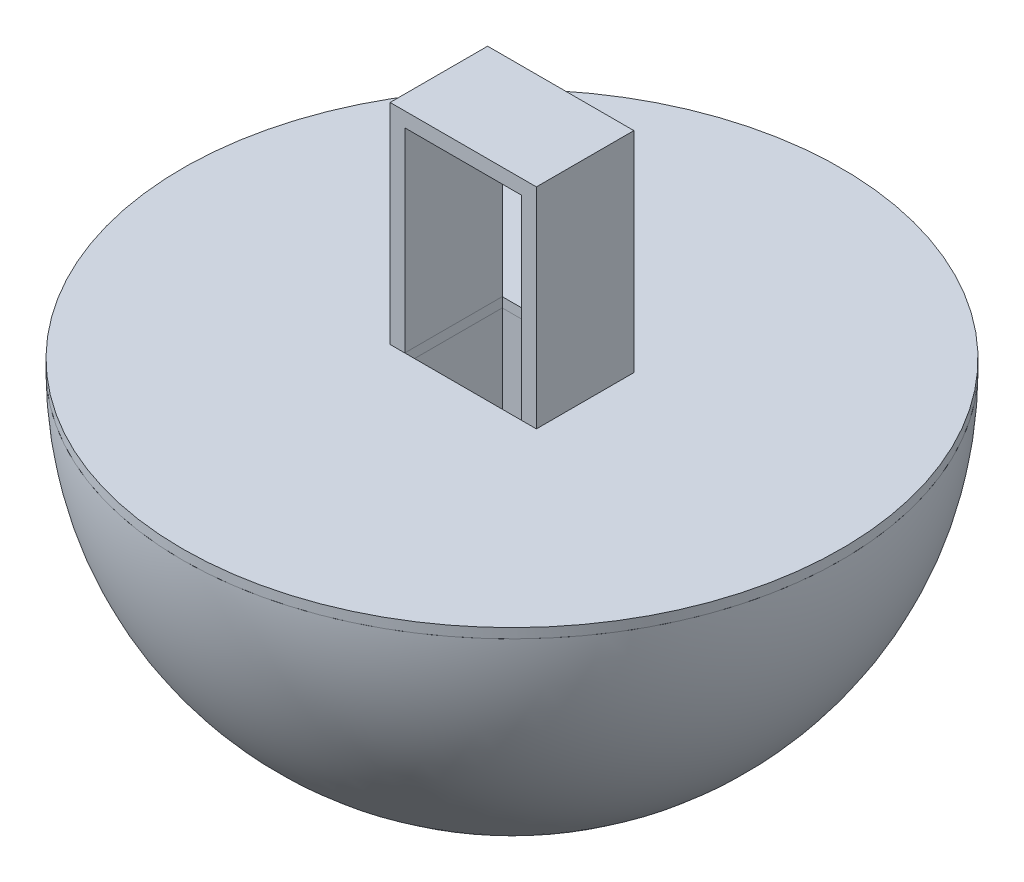
ISO-10303-21;
HEADER;
FILE_DESCRIPTION(('STEP AP214'),'2;1');
FILE_NAME('part.step','',(''),(''),'','','');
FILE_SCHEMA(('AUTOMOTIVE_DESIGN { 1 0 10303 214 1 1 1 1 }'));
ENDSEC;
DATA;
#1=APPLICATION_CONTEXT('core data for automotive mechanical design processes');
#2=APPLICATION_PROTOCOL_DEFINITION('international standard','automotive_design',2000,#1);
#3=PRODUCT_CONTEXT('',#1,'mechanical');
#4=PRODUCT('Part','Part','',(#3));
#5=PRODUCT_RELATED_PRODUCT_CATEGORY('part','',(#4));
#6=PRODUCT_DEFINITION_FORMATION('','',#4);
#7=PRODUCT_DEFINITION_CONTEXT('part definition',#1,'design');
#8=PRODUCT_DEFINITION('design','',#6,#7);
#9=PRODUCT_DEFINITION_SHAPE('','',#8);
#10=(LENGTH_UNIT() NAMED_UNIT(*) SI_UNIT(.MILLI.,.METRE.));
#11=(NAMED_UNIT(*) PLANE_ANGLE_UNIT() SI_UNIT($,.RADIAN.));
#12=(NAMED_UNIT(*) SI_UNIT($,.STERADIAN.) SOLID_ANGLE_UNIT());
#13=UNCERTAINTY_MEASURE_WITH_UNIT(LENGTH_MEASURE(1.E-05),#10,'distance_accuracy_value','');
#14=(GEOMETRIC_REPRESENTATION_CONTEXT(3) GLOBAL_UNCERTAINTY_ASSIGNED_CONTEXT((#13)) GLOBAL_UNIT_ASSIGNED_CONTEXT((#10,
#11,#12)) REPRESENTATION_CONTEXT('',''));
#15=CARTESIAN_POINT('',(0.,0.,0.));
#16=DIRECTION('',(0.,0.,1.));
#17=DIRECTION('',(1.,0.,0.));
#18=AXIS2_PLACEMENT_3D('',#15,#16,#17);
#19=CARTESIAN_POINT('',(0.,54.8,0.));
#20=DIRECTION('',(0.,1.,0.));
#21=DIRECTION('',(0.,0.,1.));
#22=AXIS2_PLACEMENT_3D('',#19,#20,#21);
#23=PLANE('',#22);
#24=DIRECTION('',(0.,0.,1.));
#25=VECTOR('',#24,1.);
#26=CARTESIAN_POINT('',(6.,54.8,-5.));
#27=LINE('',#26,#25);
#28=CARTESIAN_POINT('',(6.,54.8,-5.));
#29=VERTEX_POINT('',#28);
#30=CARTESIAN_POINT('',(6.,54.8,5.));
#31=VERTEX_POINT('',#30);
#32=EDGE_CURVE('E138',#29,#31,#27,.T.);
#33=ORIENTED_EDGE('',*,*,#32,.T.);
#34=DIRECTION('',(1.,0.,0.));
#35=VECTOR('',#34,1.);
#36=CARTESIAN_POINT('',(-7.5,54.8,5.));
#37=LINE('',#36,#35);
#38=CARTESIAN_POINT('',(-6.,54.8,5.));
#39=VERTEX_POINT('',#38);
#40=EDGE_CURVE('E135',#39,#31,#37,.T.);
#41=ORIENTED_EDGE('',*,*,#40,.F.);
#42=DIRECTION('',(0.,0.,-1.));
#43=VECTOR('',#42,1.);
#44=CARTESIAN_POINT('',(-6.,54.8,-5.));
#45=LINE('',#44,#43);
#46=CARTESIAN_POINT('',(-6.,54.8,-5.));
#47=VERTEX_POINT('',#46);
#48=EDGE_CURVE('E123',#39,#47,#45,.T.);
#49=ORIENTED_EDGE('',*,*,#48,.T.);
#50=DIRECTION('',(-1.,0.,0.));
#51=VECTOR('',#50,1.);
#52=CARTESIAN_POINT('',(-7.5,54.8,-5.));
#53=LINE('',#52,#51);
#54=EDGE_CURVE('E140',#29,#47,#53,.T.);
#55=ORIENTED_EDGE('',*,*,#54,.F.);
#56=EDGE_LOOP('',(#33,#41,#49,#55));
#57=FACE_BOUND('',#56,.T.);
#58=ADVANCED_FACE('F67',(#57),#23,.F.);
#59=CARTESIAN_POINT('',(-6.,54.8,-5.));
#60=DIRECTION('',(-1.,0.,0.));
#61=DIRECTION('',(0.,0.,1.));
#62=AXIS2_PLACEMENT_3D('',#59,#60,#61);
#63=PLANE('',#62);
#64=DIRECTION('',(0.,0.,-1.));
#65=VECTOR('',#64,1.);
#66=CARTESIAN_POINT('',(-6.,34.8,-5.));
#67=LINE('',#66,#65);
#68=CARTESIAN_POINT('',(-6.,34.8,5.));
#69=VERTEX_POINT('',#68);
#70=CARTESIAN_POINT('',(-6.,34.8,-5.));
#71=VERTEX_POINT('',#70);
#72=EDGE_CURVE('E122',#69,#71,#67,.T.);
#73=ORIENTED_EDGE('',*,*,#72,.T.);
#74=DIRECTION('',(0.,-1.,0.));
#75=VECTOR('',#74,1.);
#76=CARTESIAN_POINT('',(-6.,54.8,-5.));
#77=LINE('',#76,#75);
#78=EDGE_CURVE('E13',#47,#71,#77,.T.);
#79=ORIENTED_EDGE('',*,*,#78,.F.);
#80=ORIENTED_EDGE('',*,*,#48,.F.);
#81=DIRECTION('',(0.,-1.,0.));
#82=VECTOR('',#81,1.);
#83=CARTESIAN_POINT('',(-6.,54.8,5.));
#84=LINE('',#83,#82);
#85=EDGE_CURVE('E83',#39,#69,#84,.T.);
#86=ORIENTED_EDGE('',*,*,#85,.T.);
#87=EDGE_LOOP('',(#73,#79,#80,#86));
#88=FACE_BOUND('',#87,.T.);
#89=ADVANCED_FACE('F69',(#88),#63,.F.);
#90=CARTESIAN_POINT('',(-6.,54.8,-5.));
#91=DIRECTION('',(0.,0.,1.));
#92=DIRECTION('',(1.,0.,0.));
#93=AXIS2_PLACEMENT_3D('',#90,#91,#92);
#94=PLANE('',#93);
#95=DIRECTION('',(-1.,0.,0.));
#96=VECTOR('',#95,1.);
#97=CARTESIAN_POINT('',(-6.,34.8,-5.));
#98=LINE('',#97,#96);
#99=CARTESIAN_POINT('',(-7.5,34.8,-5.));
#100=VERTEX_POINT('',#99);
#101=EDGE_CURVE('E111',#71,#100,#98,.T.);
#102=ORIENTED_EDGE('',*,*,#101,.T.);
#103=DIRECTION('',(0.,-1.,0.));
#104=VECTOR('',#103,1.);
#105=CARTESIAN_POINT('',(-7.5,54.8,-5.));
#106=LINE('',#105,#104);
#107=CARTESIAN_POINT('',(-7.5,56.3,-5.));
#108=VERTEX_POINT('',#107);
#109=EDGE_CURVE('E76',#108,#100,#106,.T.);
#110=ORIENTED_EDGE('',*,*,#109,.F.);
#111=DIRECTION('',(-1.,0.,0.));
#112=VECTOR('',#111,1.);
#113=CARTESIAN_POINT('',(-7.5,56.3,-5.));
#114=LINE('',#113,#112);
#115=CARTESIAN_POINT('',(7.5,56.3,-5.));
#116=VERTEX_POINT('',#115);
#117=EDGE_CURVE('E150',#116,#108,#114,.T.);
#118=ORIENTED_EDGE('',*,*,#117,.F.);
#119=DIRECTION('',(0.,-1.,0.));
#120=VECTOR('',#119,1.);
#121=CARTESIAN_POINT('',(7.5,56.3,-5.));
#122=LINE('',#121,#120);
#123=CARTESIAN_POINT('',(7.5,34.8,-5.));
#124=VERTEX_POINT('',#123);
#125=EDGE_CURVE('E153',#116,#124,#122,.T.);
#126=ORIENTED_EDGE('',*,*,#125,.T.);
#127=DIRECTION('',(-1.,0.,0.));
#128=VECTOR('',#127,1.);
#129=CARTESIAN_POINT('',(6.,34.8,-5.));
#130=LINE('',#129,#128);
#131=CARTESIAN_POINT('',(6.,34.8,-5.));
#132=VERTEX_POINT('',#131);
#133=EDGE_CURVE('E194',#124,#132,#130,.T.);
#134=ORIENTED_EDGE('',*,*,#133,.T.);
#135=DIRECTION('',(0.,-1.,0.));
#136=VECTOR('',#135,1.);
#137=CARTESIAN_POINT('',(6.,54.8,-5.));
#138=LINE('',#137,#136);
#139=EDGE_CURVE('E168',#29,#132,#138,.T.);
#140=ORIENTED_EDGE('',*,*,#139,.F.);
#141=ORIENTED_EDGE('',*,*,#54,.T.);
#142=ORIENTED_EDGE('',*,*,#78,.T.);
#143=EDGE_LOOP('',(#102,#110,#118,#126,#134,#140,#141,#142));
#144=FACE_BOUND('',#143,.T.);
#145=ADVANCED_FACE('F160',(#144),#94,.F.);
#146=CARTESIAN_POINT('',(-7.5,54.8,-5.));
#147=DIRECTION('',(1.,0.,0.));
#148=DIRECTION('',(0.,0.,-1.));
#149=AXIS2_PLACEMENT_3D('',#146,#147,#148);
#150=PLANE('',#149);
#151=DIRECTION('',(0.,0.,1.));
#152=VECTOR('',#151,1.);
#153=CARTESIAN_POINT('',(-7.5,34.8,-5.));
#154=LINE('',#153,#152);
#155=CARTESIAN_POINT('',(-7.5,34.8,5.));
#156=VERTEX_POINT('',#155);
#157=EDGE_CURVE('E100',#100,#156,#154,.T.);
#158=ORIENTED_EDGE('',*,*,#157,.T.);
#159=DIRECTION('',(0.,-1.,0.));
#160=VECTOR('',#159,1.);
#161=CARTESIAN_POINT('',(-7.5,54.8,5.));
#162=LINE('',#161,#160);
#163=CARTESIAN_POINT('',(-7.5,56.3,5.));
#164=VERTEX_POINT('',#163);
#165=EDGE_CURVE('E105',#164,#156,#162,.T.);
#166=ORIENTED_EDGE('',*,*,#165,.F.);
#167=DIRECTION('',(0.,0.,1.));
#168=VECTOR('',#167,1.);
#169=CARTESIAN_POINT('',(-7.5,56.3,-5.));
#170=LINE('',#169,#168);
#171=EDGE_CURVE('E144',#108,#164,#170,.T.);
#172=ORIENTED_EDGE('',*,*,#171,.F.);
#173=ORIENTED_EDGE('',*,*,#109,.T.);
#174=EDGE_LOOP('',(#158,#166,#172,#173));
#175=FACE_BOUND('',#174,.T.);
#176=ADVANCED_FACE('F102',(#175),#150,.F.);
#177=CARTESIAN_POINT('',(-6.,54.8,5.));
#178=DIRECTION('',(0.,0.,-1.));
#179=DIRECTION('',(-1.,0.,0.));
#180=AXIS2_PLACEMENT_3D('',#177,#178,#179);
#181=PLANE('',#180);
#182=DIRECTION('',(1.,0.,0.));
#183=VECTOR('',#182,1.);
#184=CARTESIAN_POINT('',(-6.,34.8,5.));
#185=LINE('',#184,#183);
#186=EDGE_CURVE('E110',#156,#69,#185,.T.);
#187=ORIENTED_EDGE('',*,*,#186,.T.);
#188=ORIENTED_EDGE('',*,*,#85,.F.);
#189=ORIENTED_EDGE('',*,*,#40,.T.);
#190=DIRECTION('',(0.,-1.,0.));
#191=VECTOR('',#190,1.);
#192=CARTESIAN_POINT('',(6.,54.8,5.));
#193=LINE('',#192,#191);
#194=CARTESIAN_POINT('',(6.,34.8,5.));
#195=VERTEX_POINT('',#194);
#196=EDGE_CURVE('E204',#31,#195,#193,.T.);
#197=ORIENTED_EDGE('',*,*,#196,.T.);
#198=DIRECTION('',(1.,0.,0.));
#199=VECTOR('',#198,1.);
#200=CARTESIAN_POINT('',(6.,34.8,5.));
#201=LINE('',#200,#199);
#202=CARTESIAN_POINT('',(7.5,34.8,5.));
#203=VERTEX_POINT('',#202);
#204=EDGE_CURVE('E147',#195,#203,#201,.T.);
#205=ORIENTED_EDGE('',*,*,#204,.T.);
#206=DIRECTION('',(0.,-1.,0.));
#207=VECTOR('',#206,1.);
#208=CARTESIAN_POINT('',(7.5,56.3,5.));
#209=LINE('',#208,#207);
#210=CARTESIAN_POINT('',(7.5,56.3,5.));
#211=VERTEX_POINT('',#210);
#212=EDGE_CURVE('E156',#211,#203,#209,.T.);
#213=ORIENTED_EDGE('',*,*,#212,.F.);
#214=DIRECTION('',(1.,0.,0.));
#215=VECTOR('',#214,1.);
#216=CARTESIAN_POINT('',(-7.5,56.3,5.));
#217=LINE('',#216,#215);
#218=EDGE_CURVE('E116',#164,#211,#217,.T.);
#219=ORIENTED_EDGE('',*,*,#218,.F.);
#220=ORIENTED_EDGE('',*,*,#165,.T.);
#221=EDGE_LOOP('',(#187,#188,#189,#197,#205,#213,#219,#220));
#222=FACE_BOUND('',#221,.T.);
#223=ADVANCED_FACE('F113',(#222),#181,.F.);
#224=CARTESIAN_POINT('',(0.,34.8,0.));
#225=DIRECTION('',(0.,-1.,0.));
#226=DIRECTION('',(0.,0.,-1.));
#227=AXIS2_PLACEMENT_3D('',#224,#225,#226);
#228=PLANE('',#227);
#229=ORIENTED_EDGE('',*,*,#72,.F.);
#230=ORIENTED_EDGE('',*,*,#186,.F.);
#231=ORIENTED_EDGE('',*,*,#157,.F.);
#232=ORIENTED_EDGE('',*,*,#101,.F.);
#233=EDGE_LOOP('',(#229,#230,#231,#232));
#234=FACE_BOUND('',#233,.T.);
#235=ADVANCED_FACE('F120',(#234),#228,.T.);
#236=CARTESIAN_POINT('',(7.5,56.3,-5.));
#237=DIRECTION('',(-1.,0.,0.));
#238=DIRECTION('',(0.,0.,1.));
#239=AXIS2_PLACEMENT_3D('',#236,#237,#238);
#240=PLANE('',#239);
#241=ORIENTED_EDGE('',*,*,#212,.T.);
#242=DIRECTION('',(0.,0.,-1.));
#243=VECTOR('',#242,1.);
#244=CARTESIAN_POINT('',(7.5,34.8,-5.));
#245=LINE('',#244,#243);
#246=EDGE_CURVE('E192',#203,#124,#245,.T.);
#247=ORIENTED_EDGE('',*,*,#246,.T.);
#248=ORIENTED_EDGE('',*,*,#125,.F.);
#249=DIRECTION('',(0.,0.,-1.));
#250=VECTOR('',#249,1.);
#251=CARTESIAN_POINT('',(7.5,56.3,-5.));
#252=LINE('',#251,#250);
#253=EDGE_CURVE('E184',#211,#116,#252,.T.);
#254=ORIENTED_EDGE('',*,*,#253,.F.);
#255=EDGE_LOOP('',(#241,#247,#248,#254));
#256=FACE_BOUND('',#255,.T.);
#257=ADVANCED_FACE('F189',(#256),#240,.F.);
#258=CARTESIAN_POINT('',(0.,56.3,0.));
#259=DIRECTION('',(0.,1.,0.));
#260=DIRECTION('',(0.,0.,1.));
#261=AXIS2_PLACEMENT_3D('',#258,#259,#260);
#262=PLANE('',#261);
#263=ORIENTED_EDGE('',*,*,#171,.T.);
#264=ORIENTED_EDGE('',*,*,#218,.T.);
#265=ORIENTED_EDGE('',*,*,#253,.T.);
#266=ORIENTED_EDGE('',*,*,#117,.T.);
#267=EDGE_LOOP('',(#263,#264,#265,#266));
#268=FACE_BOUND('',#267,.T.);
#269=ADVANCED_FACE('F186',(#268),#262,.T.);
#270=CARTESIAN_POINT('',(6.,54.8,-5.));
#271=DIRECTION('',(1.,0.,0.));
#272=DIRECTION('',(0.,0.,-1.));
#273=AXIS2_PLACEMENT_3D('',#270,#271,#272);
#274=PLANE('',#273);
#275=DIRECTION('',(0.,0.,1.));
#276=VECTOR('',#275,1.);
#277=CARTESIAN_POINT('',(6.,34.8,-5.));
#278=LINE('',#277,#276);
#279=EDGE_CURVE('E141',#132,#195,#278,.T.);
#280=ORIENTED_EDGE('',*,*,#279,.T.);
#281=ORIENTED_EDGE('',*,*,#196,.F.);
#282=ORIENTED_EDGE('',*,*,#32,.F.);
#283=ORIENTED_EDGE('',*,*,#139,.T.);
#284=EDGE_LOOP('',(#280,#281,#282,#283));
#285=FACE_BOUND('',#284,.T.);
#286=ADVANCED_FACE('F207',(#285),#274,.F.);
#287=CARTESIAN_POINT('',(0.,34.8,0.));
#288=DIRECTION('',(0.,1.,0.));
#289=DIRECTION('',(0.,0.,1.));
#290=AXIS2_PLACEMENT_3D('',#287,#288,#289);
#291=PLANE('',#290);
#292=ORIENTED_EDGE('',*,*,#279,.F.);
#293=ORIENTED_EDGE('',*,*,#133,.F.);
#294=ORIENTED_EDGE('',*,*,#246,.F.);
#295=ORIENTED_EDGE('',*,*,#204,.F.);
#296=EDGE_LOOP('',(#292,#293,#294,#295));
#297=FACE_BOUND('',#296,.T.);
#298=ADVANCED_FACE('F202',(#297),#291,.F.);
#299=CLOSED_SHELL('',(#58,#89,#145,#176,#223,#235,#257,#269,#286,#298));
#300=MANIFOLD_SOLID_BREP('B2',#299);
#301=CARTESIAN_POINT('',(0.,34.8,0.));
#302=DIRECTION('',(0.,1.,0.));
#303=DIRECTION('',(0.,0.,1.));
#304=AXIS2_PLACEMENT_3D('',#301,#302,#303);
#305=PLANE('',#304);
#306=CARTESIAN_POINT('',(0.,34.8,0.));
#307=DIRECTION('',(0.,1.,0.));
#308=DIRECTION('',(0.,0.,1.));
#309=AXIS2_PLACEMENT_3D('',#306,#307,#308);
#310=CIRCLE('',#309,33.8);
#311=CARTESIAN_POINT('',(0.,34.8,33.8));
#312=VERTEX_POINT('',#311);
#313=EDGE_CURVE('E65',#312,#312,#310,.T.);
#314=ORIENTED_EDGE('',*,*,#313,.T.);
#315=EDGE_LOOP('',(#314));
#316=FACE_BOUND('',#315,.T.);
#317=DIRECTION('',(0.,0.,-1.));
#318=VECTOR('',#317,1.);
#319=CARTESIAN_POINT('',(6.,34.8,5.));
#320=LINE('',#319,#318);
#321=CARTESIAN_POINT('',(6.,34.8,5.));
#322=VERTEX_POINT('',#321);
#323=CARTESIAN_POINT('',(6.,34.8,-5.));
#324=VERTEX_POINT('',#323);
#325=EDGE_CURVE('E391',#322,#324,#320,.T.);
#326=ORIENTED_EDGE('',*,*,#325,.F.);
#327=DIRECTION('',(1.,0.,0.));
#328=VECTOR('',#327,1.);
#329=CARTESIAN_POINT('',(-6.,34.8,5.));
#330=LINE('',#329,#328);
#331=CARTESIAN_POINT('',(-6.,34.8,5.));
#332=VERTEX_POINT('',#331);
#333=EDGE_CURVE('E383',#332,#322,#330,.T.);
#334=ORIENTED_EDGE('',*,*,#333,.F.);
#335=DIRECTION('',(0.,0.,1.));
#336=VECTOR('',#335,1.);
#337=CARTESIAN_POINT('',(-6.,34.8,-5.));
#338=LINE('',#337,#336);
#339=CARTESIAN_POINT('',(-6.,34.8,-5.));
#340=VERTEX_POINT('',#339);
#341=EDGE_CURVE('E404',#340,#332,#338,.T.);
#342=ORIENTED_EDGE('',*,*,#341,.F.);
#343=DIRECTION('',(-1.,0.,0.));
#344=VECTOR('',#343,1.);
#345=CARTESIAN_POINT('',(6.,34.8,-5.));
#346=LINE('',#345,#344);
#347=EDGE_CURVE('E402',#324,#340,#346,.T.);
#348=ORIENTED_EDGE('',*,*,#347,.F.);
#349=EDGE_LOOP('',(#326,#334,#342,#348));
#350=FACE_BOUND('',#349,.T.);
#351=ADVANCED_FACE('F342',(#316,#350),#305,.T.);
#352=CARTESIAN_POINT('',(0.,33.8,0.));
#353=DIRECTION('',(0.,1.,0.));
#354=DIRECTION('',(0.,0.,1.));
#355=AXIS2_PLACEMENT_3D('',#352,#353,#354);
#356=PLANE('',#355);
#357=CARTESIAN_POINT('',(0.,33.8,0.));
#358=DIRECTION('',(0.,1.,0.));
#359=DIRECTION('',(0.,0.,1.));
#360=AXIS2_PLACEMENT_3D('',#357,#358,#359);
#361=CIRCLE('',#360,33.8);
#362=CARTESIAN_POINT('',(0.,33.8,33.8));
#363=VERTEX_POINT('',#362);
#364=EDGE_CURVE('E346',#363,#363,#361,.T.);
#365=ORIENTED_EDGE('',*,*,#364,.F.);
#366=EDGE_LOOP('',(#365));
#367=FACE_BOUND('',#366,.T.);
#368=DIRECTION('',(1.,0.,0.));
#369=VECTOR('',#368,1.);
#370=CARTESIAN_POINT('',(-6.,33.8,5.));
#371=LINE('',#370,#369);
#372=CARTESIAN_POINT('',(-6.,33.8,5.));
#373=VERTEX_POINT('',#372);
#374=CARTESIAN_POINT('',(6.,33.8,5.));
#375=VERTEX_POINT('',#374);
#376=EDGE_CURVE('E365',#373,#375,#371,.T.);
#377=ORIENTED_EDGE('',*,*,#376,.T.);
#378=DIRECTION('',(0.,0.,-1.));
#379=VECTOR('',#378,1.);
#380=CARTESIAN_POINT('',(6.,33.8,5.));
#381=LINE('',#380,#379);
#382=CARTESIAN_POINT('',(6.,33.8,-5.));
#383=VERTEX_POINT('',#382);
#384=EDGE_CURVE('E398',#375,#383,#381,.T.);
#385=ORIENTED_EDGE('',*,*,#384,.T.);
#386=DIRECTION('',(-1.,0.,0.));
#387=VECTOR('',#386,1.);
#388=CARTESIAN_POINT('',(6.,33.8,-5.));
#389=LINE('',#388,#387);
#390=CARTESIAN_POINT('',(-6.,33.8,-5.));
#391=VERTEX_POINT('',#390);
#392=EDGE_CURVE('E410',#383,#391,#389,.T.);
#393=ORIENTED_EDGE('',*,*,#392,.T.);
#394=DIRECTION('',(0.,0.,1.));
#395=VECTOR('',#394,1.);
#396=CARTESIAN_POINT('',(-6.,33.8,-5.));
#397=LINE('',#396,#395);
#398=EDGE_CURVE('E392',#391,#373,#397,.T.);
#399=ORIENTED_EDGE('',*,*,#398,.T.);
#400=EDGE_LOOP('',(#377,#385,#393,#399));
#401=FACE_BOUND('',#400,.T.);
#402=ADVANCED_FACE('F421',(#367,#401),#356,.F.);
#403=CARTESIAN_POINT('',(0.,34.8,0.));
#404=DIRECTION('',(0.,-1.,0.));
#405=DIRECTION('',(0.,0.,-1.));
#406=AXIS2_PLACEMENT_3D('',#403,#404,#405);
#407=CYLINDRICAL_SURFACE('',#406,33.8);
#408=ORIENTED_EDGE('',*,*,#313,.F.);
#409=EDGE_LOOP('',(#408));
#410=FACE_BOUND('',#409,.T.);
#411=ORIENTED_EDGE('',*,*,#364,.T.);
#412=EDGE_LOOP('',(#411));
#413=FACE_BOUND('',#412,.T.);
#414=ADVANCED_FACE('F344',(#410,#413),#407,.T.);
#415=CARTESIAN_POINT('',(-6.,34.8,5.));
#416=DIRECTION('',(0.,0.,-1.));
#417=DIRECTION('',(-1.,0.,0.));
#418=AXIS2_PLACEMENT_3D('',#415,#416,#417);
#419=PLANE('',#418);
#420=ORIENTED_EDGE('',*,*,#376,.F.);
#421=DIRECTION('',(0.,-1.,0.));
#422=VECTOR('',#421,1.);
#423=CARTESIAN_POINT('',(-6.,34.8,5.));
#424=LINE('',#423,#422);
#425=EDGE_CURVE('E387',#332,#373,#424,.T.);
#426=ORIENTED_EDGE('',*,*,#425,.F.);
#427=ORIENTED_EDGE('',*,*,#333,.T.);
#428=DIRECTION('',(0.,-1.,0.));
#429=VECTOR('',#428,1.);
#430=CARTESIAN_POINT('',(6.,34.8,5.));
#431=LINE('',#430,#429);
#432=EDGE_CURVE('E386',#322,#375,#431,.T.);
#433=ORIENTED_EDGE('',*,*,#432,.T.);
#434=EDGE_LOOP('',(#420,#426,#427,#433));
#435=FACE_BOUND('',#434,.T.);
#436=ADVANCED_FACE('F385',(#435),#419,.T.);
#437=CARTESIAN_POINT('',(6.,34.8,5.));
#438=DIRECTION('',(-1.,0.,0.));
#439=DIRECTION('',(0.,0.,1.));
#440=AXIS2_PLACEMENT_3D('',#437,#438,#439);
#441=PLANE('',#440);
#442=ORIENTED_EDGE('',*,*,#384,.F.);
#443=ORIENTED_EDGE('',*,*,#432,.F.);
#444=ORIENTED_EDGE('',*,*,#325,.T.);
#445=DIRECTION('',(0.,-1.,0.));
#446=VECTOR('',#445,1.);
#447=CARTESIAN_POINT('',(6.,34.8,-5.));
#448=LINE('',#447,#446);
#449=EDGE_CURVE('E399',#324,#383,#448,.T.);
#450=ORIENTED_EDGE('',*,*,#449,.T.);
#451=EDGE_LOOP('',(#442,#443,#444,#450));
#452=FACE_BOUND('',#451,.T.);
#453=ADVANCED_FACE('F395',(#452),#441,.T.);
#454=CARTESIAN_POINT('',(6.,34.8,-5.));
#455=DIRECTION('',(0.,0.,1.));
#456=DIRECTION('',(1.,0.,0.));
#457=AXIS2_PLACEMENT_3D('',#454,#455,#456);
#458=PLANE('',#457);
#459=ORIENTED_EDGE('',*,*,#392,.F.);
#460=ORIENTED_EDGE('',*,*,#449,.F.);
#461=ORIENTED_EDGE('',*,*,#347,.T.);
#462=DIRECTION('',(0.,-1.,0.));
#463=VECTOR('',#462,1.);
#464=CARTESIAN_POINT('',(-6.,34.8,-5.));
#465=LINE('',#464,#463);
#466=EDGE_CURVE('E357',#340,#391,#465,.T.);
#467=ORIENTED_EDGE('',*,*,#466,.T.);
#468=EDGE_LOOP('',(#459,#460,#461,#467));
#469=FACE_BOUND('',#468,.T.);
#470=ADVANCED_FACE('F419',(#469),#458,.T.);
#471=CARTESIAN_POINT('',(-6.,34.8,-5.));
#472=DIRECTION('',(1.,0.,0.));
#473=DIRECTION('',(0.,0.,-1.));
#474=AXIS2_PLACEMENT_3D('',#471,#472,#473);
#475=PLANE('',#474);
#476=ORIENTED_EDGE('',*,*,#398,.F.);
#477=ORIENTED_EDGE('',*,*,#466,.F.);
#478=ORIENTED_EDGE('',*,*,#341,.T.);
#479=ORIENTED_EDGE('',*,*,#425,.T.);
#480=EDGE_LOOP('',(#476,#477,#478,#479));
#481=FACE_BOUND('',#480,.T.);
#482=ADVANCED_FACE('F422',(#481),#475,.T.);
#483=CLOSED_SHELL('',(#351,#402,#414,#436,#453,#470,#482));
#484=MANIFOLD_SOLID_BREP('B7',#483);
#485=CARTESIAN_POINT('',(0.,33.8,0.));
#486=DIRECTION('',(0.,-1.,0.));
#487=DIRECTION('',(0.,0.,1.));
#488=AXIS2_PLACEMENT_3D('',#485,#486,#487);
#489=SPHERICAL_SURFACE('',#488,33.8);
#490=CARTESIAN_POINT('',(0.,33.8,0.));
#491=DIRECTION('',(0.,-1.,0.));
#492=DIRECTION('',(0.,0.,-1.));
#493=AXIS2_PLACEMENT_3D('',#490,#491,#492);
#494=CIRCLE('',#493,33.8);
#495=CARTESIAN_POINT('',(0.,33.8,-33.8));
#496=VERTEX_POINT('',#495);
#497=EDGE_CURVE('E340',#496,#496,#494,.T.);
#498=ORIENTED_EDGE('',*,*,#497,.T.);
#499=EDGE_LOOP('',(#498));
#500=FACE_BOUND('',#499,.T.);
#501=CARTESIAN_POINT('',(0.,1.2448160809987,0.));
#502=DIRECTION('',(0.,-1.,0.));
#503=DIRECTION('',(0.,0.,-1.));
#504=AXIS2_PLACEMENT_3D('',#501,#502,#503);
#505=CIRCLE('',#504,9.08845421400137);
#506=CARTESIAN_POINT('',(0.,1.2448160809987,-9.08845421400137));
#507=VERTEX_POINT('',#506);
#508=EDGE_CURVE('E585',#507,#507,#505,.T.);
#509=ORIENTED_EDGE('',*,*,#508,.F.);
#510=EDGE_LOOP('',(#509));
#511=FACE_BOUND('',#510,.T.);
#512=ADVANCED_FACE('F501',(#500,#511),#489,.T.);
#513=CARTESIAN_POINT('',(-6.,-0.002000000000002,0.));
#514=DIRECTION('',(1.,0.,0.));
#515=DIRECTION('',(0.,0.,-1.));
#516=AXIS2_PLACEMENT_3D('',#513,#514,#515);
#517=PLANE('',#516);
#518=DIRECTION('',(0.,1.,0.));
#519=VECTOR('',#518,1.);
#520=CARTESIAN_POINT('',(-6.,-0.002000000000002,5.));
#521=LINE('',#520,#519);
#522=CARTESIAN_POINT('',(-6.,15.8,5.));
#523=VERTEX_POINT('',#522);
#524=CARTESIAN_POINT('',(-6.,33.8,5.));
#525=VERTEX_POINT('',#524);
#526=EDGE_CURVE('E618',#523,#525,#521,.T.);
#527=ORIENTED_EDGE('',*,*,#526,.F.);
#528=DIRECTION('',(0.,0.,1.));
#529=VECTOR('',#528,1.);
#530=CARTESIAN_POINT('',(-6.,15.8,5.));
#531=LINE('',#530,#529);
#532=CARTESIAN_POINT('',(-6.,15.8,-5.));
#533=VERTEX_POINT('',#532);
#534=EDGE_CURVE('E522',#533,#523,#531,.T.);
#535=ORIENTED_EDGE('',*,*,#534,.F.);
#536=DIRECTION('',(0.,1.,0.));
#537=VECTOR('',#536,1.);
#538=CARTESIAN_POINT('',(-6.,-0.002000000000002,-5.));
#539=LINE('',#538,#537);
#540=CARTESIAN_POINT('',(-6.,33.8,-5.));
#541=VERTEX_POINT('',#540);
#542=EDGE_CURVE('E575',#533,#541,#539,.T.);
#543=ORIENTED_EDGE('',*,*,#542,.T.);
#544=DIRECTION('',(0.,0.,-1.));
#545=VECTOR('',#544,1.);
#546=CARTESIAN_POINT('',(-6.,33.8,0.));
#547=LINE('',#546,#545);
#548=EDGE_CURVE('E608',#525,#541,#547,.T.);
#549=ORIENTED_EDGE('',*,*,#548,.F.);
#550=EDGE_LOOP('',(#527,#535,#543,#549));
#551=FACE_BOUND('',#550,.T.);
#552=ADVANCED_FACE('F661',(#551),#517,.T.);
#553=CARTESIAN_POINT('',(0.,-0.002000000000002,5.));
#554=DIRECTION('',(0.,0.,-1.));
#555=DIRECTION('',(-1.,0.,0.));
#556=AXIS2_PLACEMENT_3D('',#553,#554,#555);
#557=PLANE('',#556);
#558=DIRECTION('',(0.,1.,0.));
#559=VECTOR('',#558,1.);
#560=CARTESIAN_POINT('',(6.,-0.002000000000002,5.));
#561=LINE('',#560,#559);
#562=CARTESIAN_POINT('',(6.,15.8,5.));
#563=VERTEX_POINT('',#562);
#564=CARTESIAN_POINT('',(6.,33.8,5.));
#565=VERTEX_POINT('',#564);
#566=EDGE_CURVE('E576',#563,#565,#561,.T.);
#567=ORIENTED_EDGE('',*,*,#566,.F.);
#568=DIRECTION('',(1.,0.,0.));
#569=VECTOR('',#568,1.);
#570=CARTESIAN_POINT('',(6.,15.8,5.));
#571=LINE('',#570,#569);
#572=EDGE_CURVE('E515',#523,#563,#571,.T.);
#573=ORIENTED_EDGE('',*,*,#572,.F.);
#574=ORIENTED_EDGE('',*,*,#526,.T.);
#575=DIRECTION('',(-1.,0.,0.));
#576=VECTOR('',#575,1.);
#577=CARTESIAN_POINT('',(0.,33.8,5.));
#578=LINE('',#577,#576);
#579=EDGE_CURVE('E605',#565,#525,#578,.T.);
#580=ORIENTED_EDGE('',*,*,#579,.F.);
#581=EDGE_LOOP('',(#567,#573,#574,#580));
#582=FACE_BOUND('',#581,.T.);
#583=ADVANCED_FACE('F666',(#582),#557,.T.);
#584=CARTESIAN_POINT('',(0.,-0.002000000000002,-5.));
#585=DIRECTION('',(0.,0.,-1.));
#586=DIRECTION('',(-1.,0.,0.));
#587=AXIS2_PLACEMENT_3D('',#584,#585,#586);
#588=PLANE('',#587);
#589=DIRECTION('',(-1.,0.,0.));
#590=VECTOR('',#589,1.);
#591=CARTESIAN_POINT('',(-6.,15.8,-5.));
#592=LINE('',#591,#590);
#593=CARTESIAN_POINT('',(6.,15.8,-5.));
#594=VERTEX_POINT('',#593);
#595=EDGE_CURVE('E579',#594,#533,#592,.T.);
#596=ORIENTED_EDGE('',*,*,#595,.F.);
#597=DIRECTION('',(0.,1.,0.));
#598=VECTOR('',#597,1.);
#599=CARTESIAN_POINT('',(6.,-0.002000000000002,-5.));
#600=LINE('',#599,#598);
#601=CARTESIAN_POINT('',(6.,33.8,-5.));
#602=VERTEX_POINT('',#601);
#603=EDGE_CURVE('E565',#594,#602,#600,.T.);
#604=ORIENTED_EDGE('',*,*,#603,.T.);
#605=DIRECTION('',(-1.,0.,0.));
#606=VECTOR('',#605,1.);
#607=CARTESIAN_POINT('',(0.,33.8,-5.));
#608=LINE('',#607,#606);
#609=EDGE_CURVE('E611',#602,#541,#608,.T.);
#610=ORIENTED_EDGE('',*,*,#609,.T.);
#611=ORIENTED_EDGE('',*,*,#542,.F.);
#612=EDGE_LOOP('',(#596,#604,#610,#611));
#613=FACE_BOUND('',#612,.T.);
#614=ADVANCED_FACE('F580',(#613),#588,.F.);
#615=CARTESIAN_POINT('',(6.,-0.002000000000002,0.));
#616=DIRECTION('',(1.,0.,0.));
#617=DIRECTION('',(0.,0.,-1.));
#618=AXIS2_PLACEMENT_3D('',#615,#616,#617);
#619=PLANE('',#618);
#620=DIRECTION('',(0.,0.,-1.));
#621=VECTOR('',#620,1.);
#622=CARTESIAN_POINT('',(6.,15.8,-5.));
#623=LINE('',#622,#621);
#624=EDGE_CURVE('E569',#563,#594,#623,.T.);
#625=ORIENTED_EDGE('',*,*,#624,.F.);
#626=ORIENTED_EDGE('',*,*,#566,.T.);
#627=DIRECTION('',(0.,0.,-1.));
#628=VECTOR('',#627,1.);
#629=CARTESIAN_POINT('',(6.,33.8,0.));
#630=LINE('',#629,#628);
#631=EDGE_CURVE('E571',#565,#602,#630,.T.);
#632=ORIENTED_EDGE('',*,*,#631,.T.);
#633=ORIENTED_EDGE('',*,*,#603,.F.);
#634=EDGE_LOOP('',(#625,#626,#632,#633));
#635=FACE_BOUND('',#634,.T.);
#636=ADVANCED_FACE('F567',(#635),#619,.F.);
#637=CARTESIAN_POINT('',(0.,33.8,0.));
#638=DIRECTION('',(0.,-1.,0.));
#639=DIRECTION('',(0.,0.,-1.));
#640=AXIS2_PLACEMENT_3D('',#637,#638,#639);
#641=PLANE('',#640);
#642=CARTESIAN_POINT('',(0.,33.8,0.));
#643=DIRECTION('',(0.,-1.,0.));
#644=DIRECTION('',(0.,0.,-1.));
#645=AXIS2_PLACEMENT_3D('',#642,#643,#644);
#646=CIRCLE('',#645,32.8);
#647=CARTESIAN_POINT('',(0.,33.8,-32.8));
#648=VERTEX_POINT('',#647);
#649=EDGE_CURVE('E508',#648,#648,#646,.T.);
#650=ORIENTED_EDGE('',*,*,#649,.T.);
#651=EDGE_LOOP('',(#650));
#652=FACE_BOUND('',#651,.T.);
#653=ORIENTED_EDGE('',*,*,#497,.F.);
#654=EDGE_LOOP('',(#653));
#655=FACE_BOUND('',#654,.T.);
#656=ADVANCED_FACE('F638',(#652,#655),#641,.F.);
#657=CARTESIAN_POINT('',(0.,33.8,0.));
#658=DIRECTION('',(0.,-1.,0.));
#659=DIRECTION('',(0.,0.,1.));
#660=AXIS2_PLACEMENT_3D('',#657,#658,#659);
#661=SPHERICAL_SURFACE('',#660,32.8);
#662=CARTESIAN_POINT('',(7.,33.8,0.));
#663=DIRECTION('',(1.,0.,0.));
#664=DIRECTION('',(0.,0.,-1.));
#665=AXIS2_PLACEMENT_3D('',#662,#663,#664);
#666=CIRCLE('',#665,32.0443442747702);
#667=CARTESIAN_POINT('',(7.,2.32238890894038,-6.));
#668=VERTEX_POINT('',#667);
#669=CARTESIAN_POINT('',(7.,2.32238890894038,6.));
#670=VERTEX_POINT('',#669);
#671=EDGE_CURVE('E632',#668,#670,#666,.F.);
#672=ORIENTED_EDGE('',*,*,#671,.T.);
#673=CARTESIAN_POINT('',(0.,33.8,6.));
#674=DIRECTION('',(0.,0.,-1.));
#675=DIRECTION('',(-1.,0.,0.));
#676=AXIS2_PLACEMENT_3D('',#673,#674,#675);
#677=CIRCLE('',#676,32.2465502030837);
#678=CARTESIAN_POINT('',(-7.,2.32238890894038,6.));
#679=VERTEX_POINT('',#678);
#680=EDGE_CURVE('E628',#679,#670,#677,.F.);
#681=ORIENTED_EDGE('',*,*,#680,.F.);
#682=CARTESIAN_POINT('',(-7.,33.8,0.));
#683=DIRECTION('',(1.,0.,0.));
#684=DIRECTION('',(0.,0.,-1.));
#685=AXIS2_PLACEMENT_3D('',#682,#683,#684);
#686=CIRCLE('',#685,32.0443442747702);
#687=CARTESIAN_POINT('',(-7.,2.32238890894038,-6.));
#688=VERTEX_POINT('',#687);
#689=EDGE_CURVE('E620',#688,#679,#686,.F.);
#690=ORIENTED_EDGE('',*,*,#689,.F.);
#691=CARTESIAN_POINT('',(0.,33.8,-6.));
#692=DIRECTION('',(0.,0.,-1.));
#693=DIRECTION('',(-1.,0.,0.));
#694=AXIS2_PLACEMENT_3D('',#691,#692,#693);
#695=CIRCLE('',#694,32.2465502030837);
#696=EDGE_CURVE('E629',#688,#668,#695,.F.);
#697=ORIENTED_EDGE('',*,*,#696,.T.);
#698=EDGE_LOOP('',(#672,#681,#690,#697));
#699=FACE_BOUND('',#698,.T.);
#700=ORIENTED_EDGE('',*,*,#649,.F.);
#701=EDGE_LOOP('',(#700));
#702=FACE_BOUND('',#701,.T.);
#703=ADVANCED_FACE('F641',(#699,#702),#661,.F.);
#704=CARTESIAN_POINT('',(7.,-0.002000000000002,0.));
#705=DIRECTION('',(1.,0.,0.));
#706=DIRECTION('',(0.,0.,-1.));
#707=AXIS2_PLACEMENT_3D('',#704,#705,#706);
#708=PLANE('',#707);
#709=ORIENTED_EDGE('',*,*,#671,.F.);
#710=DIRECTION('',(0.,1.,0.));
#711=VECTOR('',#710,1.);
#712=CARTESIAN_POINT('',(7.,-0.002000000000002,-6.));
#713=LINE('',#712,#711);
#714=CARTESIAN_POINT('',(7.,33.8,-6.));
#715=VERTEX_POINT('',#714);
#716=EDGE_CURVE('E624',#668,#715,#713,.T.);
#717=ORIENTED_EDGE('',*,*,#716,.T.);
#718=DIRECTION('',(0.,0.,-1.));
#719=VECTOR('',#718,1.);
#720=CARTESIAN_POINT('',(7.,33.8,0.));
#721=LINE('',#720,#719);
#722=CARTESIAN_POINT('',(7.,33.8,6.));
#723=VERTEX_POINT('',#722);
#724=EDGE_CURVE('E596',#723,#715,#721,.T.);
#725=ORIENTED_EDGE('',*,*,#724,.F.);
#726=DIRECTION('',(0.,1.,0.));
#727=VECTOR('',#726,1.);
#728=CARTESIAN_POINT('',(7.,-0.002000000000002,6.));
#729=LINE('',#728,#727);
#730=EDGE_CURVE('E615',#670,#723,#729,.T.);
#731=ORIENTED_EDGE('',*,*,#730,.F.);
#732=EDGE_LOOP('',(#709,#717,#725,#731));
#733=FACE_BOUND('',#732,.T.);
#734=ADVANCED_FACE('F643',(#733),#708,.T.);
#735=CARTESIAN_POINT('',(0.,33.8,0.));
#736=DIRECTION('',(0.,1.,0.));
#737=DIRECTION('',(0.,0.,1.));
#738=AXIS2_PLACEMENT_3D('',#735,#736,#737);
#739=PLANE('',#738);
#740=DIRECTION('',(-1.,0.,0.));
#741=VECTOR('',#740,1.);
#742=CARTESIAN_POINT('',(0.,33.8,6.));
#743=LINE('',#742,#741);
#744=CARTESIAN_POINT('',(-7.,33.8,6.));
#745=VERTEX_POINT('',#744);
#746=EDGE_CURVE('E593',#723,#745,#743,.T.);
#747=ORIENTED_EDGE('',*,*,#746,.F.);
#748=ORIENTED_EDGE('',*,*,#724,.T.);
#749=DIRECTION('',(-1.,0.,0.));
#750=VECTOR('',#749,1.);
#751=CARTESIAN_POINT('',(0.,33.8,-6.));
#752=LINE('',#751,#750);
#753=CARTESIAN_POINT('',(-7.,33.8,-6.));
#754=VERTEX_POINT('',#753);
#755=EDGE_CURVE('E599',#715,#754,#752,.T.);
#756=ORIENTED_EDGE('',*,*,#755,.T.);
#757=DIRECTION('',(0.,0.,-1.));
#758=VECTOR('',#757,1.);
#759=CARTESIAN_POINT('',(-7.,33.8,0.));
#760=LINE('',#759,#758);
#761=EDGE_CURVE('E602',#745,#754,#760,.T.);
#762=ORIENTED_EDGE('',*,*,#761,.F.);
#763=EDGE_LOOP('',(#747,#748,#756,#762));
#764=FACE_BOUND('',#763,.T.);
#765=ORIENTED_EDGE('',*,*,#579,.T.);
#766=ORIENTED_EDGE('',*,*,#548,.T.);
#767=ORIENTED_EDGE('',*,*,#609,.F.);
#768=ORIENTED_EDGE('',*,*,#631,.F.);
#769=EDGE_LOOP('',(#765,#766,#767,#768));
#770=FACE_BOUND('',#769,.T.);
#771=ADVANCED_FACE('F651',(#764,#770),#739,.T.);
#772=CARTESIAN_POINT('',(0.,-0.002000000000002,6.));
#773=DIRECTION('',(0.,0.,-1.));
#774=DIRECTION('',(-1.,0.,0.));
#775=AXIS2_PLACEMENT_3D('',#772,#773,#774);
#776=PLANE('',#775);
#777=DIRECTION('',(0.,1.,0.));
#778=VECTOR('',#777,1.);
#779=CARTESIAN_POINT('',(-7.,-0.002000000000002,6.));
#780=LINE('',#779,#778);
#781=EDGE_CURVE('E614',#679,#745,#780,.T.);
#782=ORIENTED_EDGE('',*,*,#781,.F.);
#783=ORIENTED_EDGE('',*,*,#680,.T.);
#784=ORIENTED_EDGE('',*,*,#730,.T.);
#785=ORIENTED_EDGE('',*,*,#746,.T.);
#786=EDGE_LOOP('',(#782,#783,#784,#785));
#787=FACE_BOUND('',#786,.T.);
#788=ADVANCED_FACE('F692',(#787),#776,.F.);
#789=CARTESIAN_POINT('',(0.,-0.002000000000002,-6.));
#790=DIRECTION('',(0.,0.,-1.));
#791=DIRECTION('',(-1.,0.,0.));
#792=AXIS2_PLACEMENT_3D('',#789,#790,#791);
#793=PLANE('',#792);
#794=ORIENTED_EDGE('',*,*,#696,.F.);
#795=DIRECTION('',(0.,1.,0.));
#796=VECTOR('',#795,1.);
#797=CARTESIAN_POINT('',(-7.,-0.002000000000002,-6.));
#798=LINE('',#797,#796);
#799=EDGE_CURVE('E622',#688,#754,#798,.T.);
#800=ORIENTED_EDGE('',*,*,#799,.T.);
#801=ORIENTED_EDGE('',*,*,#755,.F.);
#802=ORIENTED_EDGE('',*,*,#716,.F.);
#803=EDGE_LOOP('',(#794,#800,#801,#802));
#804=FACE_BOUND('',#803,.T.);
#805=ADVANCED_FACE('F657',(#804),#793,.T.);
#806=CARTESIAN_POINT('',(-7.,-0.002000000000002,0.));
#807=DIRECTION('',(1.,0.,0.));
#808=DIRECTION('',(0.,0.,-1.));
#809=AXIS2_PLACEMENT_3D('',#806,#807,#808);
#810=PLANE('',#809);
#811=ORIENTED_EDGE('',*,*,#799,.F.);
#812=ORIENTED_EDGE('',*,*,#689,.T.);
#813=ORIENTED_EDGE('',*,*,#781,.T.);
#814=ORIENTED_EDGE('',*,*,#761,.T.);
#815=EDGE_LOOP('',(#811,#812,#813,#814));
#816=FACE_BOUND('',#815,.T.);
#817=ADVANCED_FACE('F646',(#816),#810,.F.);
#818=CARTESIAN_POINT('',(0.,-0.00199999999999853,0.));
#819=DIRECTION('',(0.,1.,0.));
#820=DIRECTION('',(0.,0.,1.));
#821=AXIS2_PLACEMENT_3D('',#818,#819,#820);
#822=CYLINDRICAL_SURFACE('',#821,4.);
#823=CARTESIAN_POINT('',(0.,1.2448160809987,0.));
#824=DIRECTION('',(0.,-1.,0.));
#825=DIRECTION('',(0.,0.,-1.));
#826=AXIS2_PLACEMENT_3D('',#823,#824,#825);
#827=CIRCLE('',#826,3.99999999999991);
#828=CARTESIAN_POINT('',(0.,1.2448160809987,-3.99999999999991));
#829=VERTEX_POINT('',#828);
#830=EDGE_CURVE('E589',#829,#829,#827,.T.);
#831=ORIENTED_EDGE('',*,*,#830,.T.);
#832=EDGE_LOOP('',(#831));
#833=FACE_BOUND('',#832,.T.);
#834=CARTESIAN_POINT('',(0.,15.8,0.));
#835=DIRECTION('',(0.,1.,0.));
#836=DIRECTION('',(0.,0.,1.));
#837=AXIS2_PLACEMENT_3D('',#834,#835,#836);
#838=CIRCLE('',#837,4.);
#839=CARTESIAN_POINT('',(0.,15.8,4.));
#840=VERTEX_POINT('',#839);
#841=EDGE_CURVE('E582',#840,#840,#838,.T.);
#842=ORIENTED_EDGE('',*,*,#841,.T.);
#843=EDGE_LOOP('',(#842));
#844=FACE_BOUND('',#843,.T.);
#845=ADVANCED_FACE('F656',(#833,#844),#822,.F.);
#846=CARTESIAN_POINT('',(0.,15.8,0.));
#847=DIRECTION('',(0.,-1.,0.));
#848=DIRECTION('',(0.,0.,-1.));
#849=AXIS2_PLACEMENT_3D('',#846,#847,#848);
#850=PLANE('',#849);
#851=ORIENTED_EDGE('',*,*,#841,.F.);
#852=EDGE_LOOP('',(#851));
#853=FACE_BOUND('',#852,.T.);
#854=ORIENTED_EDGE('',*,*,#624,.T.);
#855=ORIENTED_EDGE('',*,*,#595,.T.);
#856=ORIENTED_EDGE('',*,*,#534,.T.);
#857=ORIENTED_EDGE('',*,*,#572,.T.);
#858=EDGE_LOOP('',(#854,#855,#856,#857));
#859=FACE_BOUND('',#858,.T.);
#860=ADVANCED_FACE('F584',(#853,#859),#850,.F.);
#861=CARTESIAN_POINT('',(0.,1.2448160809987,0.));
#862=DIRECTION('',(0.,-1.,0.));
#863=DIRECTION('',(0.,0.,-1.));
#864=AXIS2_PLACEMENT_3D('',#861,#862,#863);
#865=PLANE('',#864);
#866=ORIENTED_EDGE('',*,*,#830,.F.);
#867=EDGE_LOOP('',(#866));
#868=FACE_BOUND('',#867,.T.);
#869=ORIENTED_EDGE('',*,*,#508,.T.);
#870=EDGE_LOOP('',(#869));
#871=FACE_BOUND('',#870,.T.);
#872=ADVANCED_FACE('F672',(#868,#871),#865,.T.);
#873=CLOSED_SHELL('',(#512,#552,#583,#614,#636,#656,#703,#734,#771,#788,#805,#817,#845,#860,#872));
#874=MANIFOLD_SOLID_BREP('B59',#873);
#875=ADVANCED_BREP_SHAPE_REPRESENTATION('',(#18,#300,#484,#874),#14);
#876=SHAPE_DEFINITION_REPRESENTATION(#9,#875);
ENDSEC;
END-ISO-10303-21;
